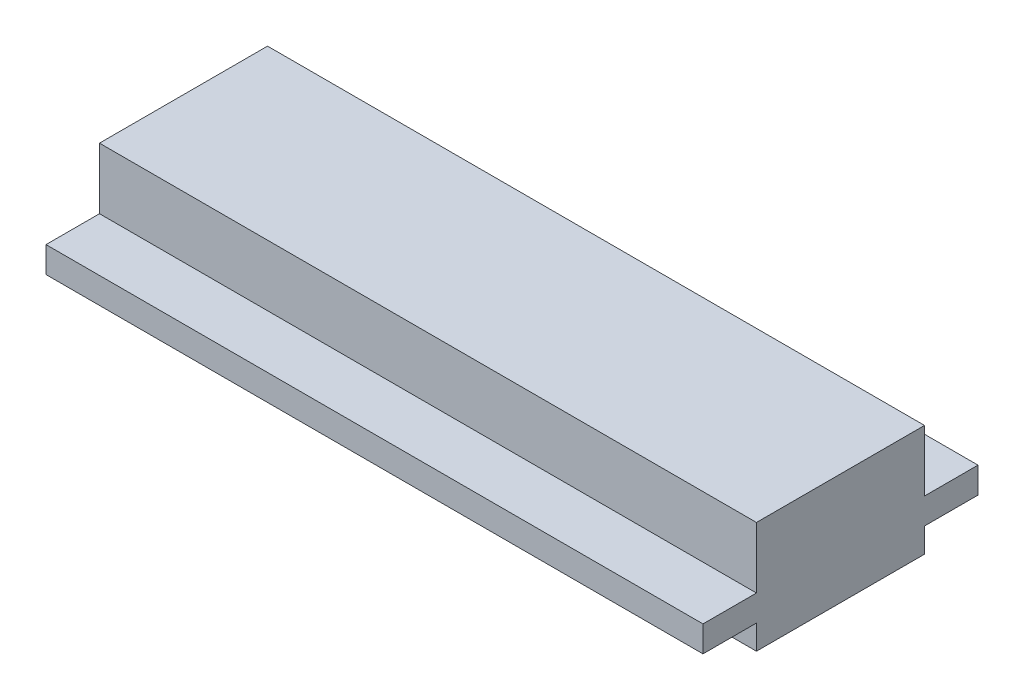
ISO-10303-21;
HEADER;
FILE_DESCRIPTION(('STEP AP214'),'2;1');
FILE_NAME('part.step','',(''),(''),'','','');
FILE_SCHEMA(('AUTOMOTIVE_DESIGN { 1 0 10303 214 1 1 1 1 }'));
ENDSEC;
DATA;
#1=APPLICATION_CONTEXT('core data for automotive mechanical design processes');
#2=APPLICATION_PROTOCOL_DEFINITION('international standard','automotive_design',2000,#1);
#3=PRODUCT_CONTEXT('',#1,'mechanical');
#4=PRODUCT('Part','Part','',(#3));
#5=PRODUCT_RELATED_PRODUCT_CATEGORY('part','',(#4));
#6=PRODUCT_DEFINITION_FORMATION('','',#4);
#7=PRODUCT_DEFINITION_CONTEXT('part definition',#1,'design');
#8=PRODUCT_DEFINITION('design','',#6,#7);
#9=PRODUCT_DEFINITION_SHAPE('','',#8);
#10=(LENGTH_UNIT() NAMED_UNIT(*) SI_UNIT(.MILLI.,.METRE.));
#11=(NAMED_UNIT(*) PLANE_ANGLE_UNIT() SI_UNIT($,.RADIAN.));
#12=(NAMED_UNIT(*) SI_UNIT($,.STERADIAN.) SOLID_ANGLE_UNIT());
#13=UNCERTAINTY_MEASURE_WITH_UNIT(LENGTH_MEASURE(1.E-05),#10,'distance_accuracy_value','');
#14=(GEOMETRIC_REPRESENTATION_CONTEXT(3) GLOBAL_UNCERTAINTY_ASSIGNED_CONTEXT((#13)) GLOBAL_UNIT_ASSIGNED_CONTEXT((#10,
#11,#12)) REPRESENTATION_CONTEXT('',''));
#15=CARTESIAN_POINT('',(0.,0.,0.));
#16=DIRECTION('',(0.,0.,1.));
#17=DIRECTION('',(1.,0.,0.));
#18=AXIS2_PLACEMENT_3D('',#15,#16,#17);
#19=CARTESIAN_POINT('',(0.,0.,0.));
#20=DIRECTION('',(0.,-1.,0.));
#21=DIRECTION('',(0.,0.,-1.));
#22=AXIS2_PLACEMENT_3D('',#19,#20,#21);
#23=PLANE('',#22);
#24=DIRECTION('',(-1.,0.,0.));
#25=VECTOR('',#24,1.);
#26=CARTESIAN_POINT('',(43.,0.,-3.5));
#27=LINE('',#26,#25);
#28=CARTESIAN_POINT('',(43.,0.,-3.5));
#29=VERTEX_POINT('',#28);
#30=CARTESIAN_POINT('',(0.,0.,-3.5));
#31=VERTEX_POINT('',#30);
#32=EDGE_CURVE('E49',#29,#31,#27,.T.);
#33=ORIENTED_EDGE('',*,*,#32,.F.);
#34=DIRECTION('',(0.,0.,-1.));
#35=VECTOR('',#34,1.);
#36=CARTESIAN_POINT('',(43.,0.,0.));
#37=LINE('',#36,#35);
#38=CARTESIAN_POINT('',(43.,0.,0.));
#39=VERTEX_POINT('',#38);
#40=EDGE_CURVE('E194',#39,#29,#37,.T.);
#41=ORIENTED_EDGE('',*,*,#40,.F.);
#42=DIRECTION('',(1.,0.,0.));
#43=VECTOR('',#42,1.);
#44=CARTESIAN_POINT('',(0.,0.,0.));
#45=LINE('',#44,#43);
#46=CARTESIAN_POINT('',(0.,0.,0.));
#47=VERTEX_POINT('',#46);
#48=EDGE_CURVE('E191',#47,#39,#45,.T.);
#49=ORIENTED_EDGE('',*,*,#48,.F.);
#50=DIRECTION('',(0.,0.,1.));
#51=VECTOR('',#50,1.);
#52=CARTESIAN_POINT('',(0.,0.,0.));
#53=LINE('',#52,#51);
#54=EDGE_CURVE('E54',#31,#47,#53,.T.);
#55=ORIENTED_EDGE('',*,*,#54,.F.);
#56=EDGE_LOOP('',(#33,#41,#49,#55));
#57=FACE_BOUND('',#56,.T.);
#58=ADVANCED_FACE('F34',(#57),#23,.T.);
#59=CARTESIAN_POINT('',(0.,1.7,0.));
#60=DIRECTION('',(0.,-1.,0.));
#61=DIRECTION('',(0.,0.,-1.));
#62=AXIS2_PLACEMENT_3D('',#59,#60,#61);
#63=PLANE('',#62);
#64=DIRECTION('',(-1.,0.,0.));
#65=VECTOR('',#64,1.);
#66=CARTESIAN_POINT('',(43.,1.7,-14.5));
#67=LINE('',#66,#65);
#68=CARTESIAN_POINT('',(43.,1.7,-14.5));
#69=VERTEX_POINT('',#68);
#70=CARTESIAN_POINT('',(0.,1.7,-14.5));
#71=VERTEX_POINT('',#70);
#72=EDGE_CURVE('E150',#69,#71,#67,.T.);
#73=ORIENTED_EDGE('',*,*,#72,.F.);
#74=DIRECTION('',(0.,0.,-1.));
#75=VECTOR('',#74,1.);
#76=CARTESIAN_POINT('',(43.,1.7,0.));
#77=LINE('',#76,#75);
#78=CARTESIAN_POINT('',(43.,1.7,-18.));
#79=VERTEX_POINT('',#78);
#80=EDGE_CURVE('E184',#69,#79,#77,.T.);
#81=ORIENTED_EDGE('',*,*,#80,.T.);
#82=DIRECTION('',(-1.,0.,0.));
#83=VECTOR('',#82,1.);
#84=CARTESIAN_POINT('',(0.,1.7,-18.));
#85=LINE('',#84,#83);
#86=CARTESIAN_POINT('',(0.,1.7,-18.));
#87=VERTEX_POINT('',#86);
#88=EDGE_CURVE('E187',#79,#87,#85,.T.);
#89=ORIENTED_EDGE('',*,*,#88,.T.);
#90=DIRECTION('',(0.,0.,1.));
#91=VECTOR('',#90,1.);
#92=CARTESIAN_POINT('',(0.,1.7,0.));
#93=LINE('',#92,#91);
#94=EDGE_CURVE('E179',#87,#71,#93,.T.);
#95=ORIENTED_EDGE('',*,*,#94,.T.);
#96=EDGE_LOOP('',(#73,#81,#89,#95));
#97=FACE_BOUND('',#96,.T.);
#98=ADVANCED_FACE('F233',(#97),#63,.F.);
#99=DIRECTION('',(1.,0.,0.));
#100=VECTOR('',#99,1.);
#101=CARTESIAN_POINT('',(43.,1.7,-3.5));
#102=LINE('',#101,#100);
#103=CARTESIAN_POINT('',(0.,1.7,-3.5));
#104=VERTEX_POINT('',#103);
#105=CARTESIAN_POINT('',(43.,1.7,-3.5));
#106=VERTEX_POINT('',#105);
#107=EDGE_CURVE('E147',#104,#106,#102,.T.);
#108=ORIENTED_EDGE('',*,*,#107,.F.);
#109=CARTESIAN_POINT('',(0.,1.7,0.));
#110=VERTEX_POINT('',#109);
#111=EDGE_CURVE('E182',#104,#110,#93,.T.);
#112=ORIENTED_EDGE('',*,*,#111,.T.);
#113=DIRECTION('',(1.,0.,0.));
#114=VECTOR('',#113,1.);
#115=CARTESIAN_POINT('',(0.,1.7,0.));
#116=LINE('',#115,#114);
#117=CARTESIAN_POINT('',(43.,1.7,0.));
#118=VERTEX_POINT('',#117);
#119=EDGE_CURVE('E181',#110,#118,#116,.T.);
#120=ORIENTED_EDGE('',*,*,#119,.T.);
#121=EDGE_CURVE('E185',#118,#106,#77,.T.);
#122=ORIENTED_EDGE('',*,*,#121,.T.);
#123=EDGE_LOOP('',(#108,#112,#120,#122));
#124=FACE_BOUND('',#123,.T.);
#125=ADVANCED_FACE('F239',(#124),#63,.F.);
#126=CARTESIAN_POINT('',(0.,1.7,0.));
#127=DIRECTION('',(1.,0.,0.));
#128=DIRECTION('',(0.,0.,-1.));
#129=AXIS2_PLACEMENT_3D('',#126,#127,#128);
#130=PLANE('',#129);
#131=CARTESIAN_POINT('',(0.,0.,-18.));
#132=VERTEX_POINT('',#131);
#133=CARTESIAN_POINT('',(0.,0.,-14.5));
#134=VERTEX_POINT('',#133);
#135=EDGE_CURVE('E146',#132,#134,#53,.T.);
#136=ORIENTED_EDGE('',*,*,#135,.T.);
#137=DIRECTION('',(0.,1.,0.));
#138=VECTOR('',#137,1.);
#139=CARTESIAN_POINT('',(0.,-1.6,-14.5));
#140=LINE('',#139,#138);
#141=CARTESIAN_POINT('',(0.,-1.6,-14.5));
#142=VERTEX_POINT('',#141);
#143=EDGE_CURVE('E127',#142,#134,#140,.T.);
#144=ORIENTED_EDGE('',*,*,#143,.F.);
#145=DIRECTION('',(0.,0.,-1.));
#146=VECTOR('',#145,1.);
#147=CARTESIAN_POINT('',(0.,-1.6,-14.5));
#148=LINE('',#147,#146);
#149=CARTESIAN_POINT('',(0.,-1.6,-3.5));
#150=VERTEX_POINT('',#149);
#151=EDGE_CURVE('E133',#150,#142,#148,.T.);
#152=ORIENTED_EDGE('',*,*,#151,.F.);
#153=DIRECTION('',(0.,1.,0.));
#154=VECTOR('',#153,1.);
#155=CARTESIAN_POINT('',(0.,-1.6,-3.5));
#156=LINE('',#155,#154);
#157=EDGE_CURVE('E214',#150,#31,#156,.T.);
#158=ORIENTED_EDGE('',*,*,#157,.T.);
#159=ORIENTED_EDGE('',*,*,#54,.T.);
#160=DIRECTION('',(0.,-1.,0.));
#161=VECTOR('',#160,1.);
#162=CARTESIAN_POINT('',(0.,1.7,0.));
#163=LINE('',#162,#161);
#164=EDGE_CURVE('E11',#110,#47,#163,.T.);
#165=ORIENTED_EDGE('',*,*,#164,.F.);
#166=ORIENTED_EDGE('',*,*,#111,.F.);
#167=DIRECTION('',(0.,-1.,0.));
#168=VECTOR('',#167,1.);
#169=CARTESIAN_POINT('',(0.,5.7,-3.5));
#170=LINE('',#169,#168);
#171=CARTESIAN_POINT('',(0.,5.7,-3.5));
#172=VERTEX_POINT('',#171);
#173=EDGE_CURVE('E176',#172,#104,#170,.T.);
#174=ORIENTED_EDGE('',*,*,#173,.F.);
#175=DIRECTION('',(0.,0.,1.));
#176=VECTOR('',#175,1.);
#177=CARTESIAN_POINT('',(0.,5.7,-3.5));
#178=LINE('',#177,#176);
#179=CARTESIAN_POINT('',(0.,5.7,-14.5));
#180=VERTEX_POINT('',#179);
#181=EDGE_CURVE('E156',#180,#172,#178,.T.);
#182=ORIENTED_EDGE('',*,*,#181,.F.);
#183=DIRECTION('',(0.,-1.,0.));
#184=VECTOR('',#183,1.);
#185=CARTESIAN_POINT('',(0.,5.7,-14.5));
#186=LINE('',#185,#184);
#187=EDGE_CURVE('E164',#180,#71,#186,.T.);
#188=ORIENTED_EDGE('',*,*,#187,.T.);
#189=ORIENTED_EDGE('',*,*,#94,.F.);
#190=DIRECTION('',(0.,-1.,0.));
#191=VECTOR('',#190,1.);
#192=CARTESIAN_POINT('',(0.,1.7,-18.));
#193=LINE('',#192,#191);
#194=EDGE_CURVE('E189',#87,#132,#193,.T.);
#195=ORIENTED_EDGE('',*,*,#194,.T.);
#196=EDGE_LOOP('',(#136,#144,#152,#158,#159,#165,#166,#174,#182,#188,#189,#195));
#197=FACE_BOUND('',#196,.T.);
#198=ADVANCED_FACE('F36',(#197),#130,.F.);
#199=CARTESIAN_POINT('',(0.,1.7,0.));
#200=DIRECTION('',(0.,0.,-1.));
#201=DIRECTION('',(-1.,0.,0.));
#202=AXIS2_PLACEMENT_3D('',#199,#200,#201);
#203=PLANE('',#202);
#204=ORIENTED_EDGE('',*,*,#48,.T.);
#205=DIRECTION('',(0.,-1.,0.));
#206=VECTOR('',#205,1.);
#207=CARTESIAN_POINT('',(43.,1.7,0.));
#208=LINE('',#207,#206);
#209=EDGE_CURVE('E42',#118,#39,#208,.T.);
#210=ORIENTED_EDGE('',*,*,#209,.F.);
#211=ORIENTED_EDGE('',*,*,#119,.F.);
#212=ORIENTED_EDGE('',*,*,#164,.T.);
#213=EDGE_LOOP('',(#204,#210,#211,#212));
#214=FACE_BOUND('',#213,.T.);
#215=ADVANCED_FACE('F211',(#214),#203,.F.);
#216=CARTESIAN_POINT('',(43.,1.7,0.));
#217=DIRECTION('',(-1.,0.,0.));
#218=DIRECTION('',(0.,0.,1.));
#219=AXIS2_PLACEMENT_3D('',#216,#217,#218);
#220=PLANE('',#219);
#221=ORIENTED_EDGE('',*,*,#40,.T.);
#222=DIRECTION('',(0.,1.,0.));
#223=VECTOR('',#222,1.);
#224=CARTESIAN_POINT('',(43.,-1.6,-3.5));
#225=LINE('',#224,#223);
#226=CARTESIAN_POINT('',(43.,-1.6,-3.5));
#227=VERTEX_POINT('',#226);
#228=EDGE_CURVE('E152',#227,#29,#225,.T.);
#229=ORIENTED_EDGE('',*,*,#228,.F.);
#230=DIRECTION('',(0.,0.,1.));
#231=VECTOR('',#230,1.);
#232=CARTESIAN_POINT('',(43.,-1.6,-14.5));
#233=LINE('',#232,#231);
#234=CARTESIAN_POINT('',(43.,-1.6,-14.5));
#235=VERTEX_POINT('',#234);
#236=EDGE_CURVE('E132',#235,#227,#233,.T.);
#237=ORIENTED_EDGE('',*,*,#236,.F.);
#238=DIRECTION('',(0.,1.,0.));
#239=VECTOR('',#238,1.);
#240=CARTESIAN_POINT('',(43.,-1.6,-14.5));
#241=LINE('',#240,#239);
#242=CARTESIAN_POINT('',(43.,0.,-14.5));
#243=VERTEX_POINT('',#242);
#244=EDGE_CURVE('E129',#235,#243,#241,.T.);
#245=ORIENTED_EDGE('',*,*,#244,.T.);
#246=CARTESIAN_POINT('',(43.,0.,-18.));
#247=VERTEX_POINT('',#246);
#248=EDGE_CURVE('E193',#243,#247,#37,.T.);
#249=ORIENTED_EDGE('',*,*,#248,.T.);
#250=DIRECTION('',(0.,-1.,0.));
#251=VECTOR('',#250,1.);
#252=CARTESIAN_POINT('',(43.,1.7,-18.));
#253=LINE('',#252,#251);
#254=EDGE_CURVE('E199',#79,#247,#253,.T.);
#255=ORIENTED_EDGE('',*,*,#254,.F.);
#256=ORIENTED_EDGE('',*,*,#80,.F.);
#257=DIRECTION('',(0.,-1.,0.));
#258=VECTOR('',#257,1.);
#259=CARTESIAN_POINT('',(43.,5.7,-14.5));
#260=LINE('',#259,#258);
#261=CARTESIAN_POINT('',(43.,5.7,-14.5));
#262=VERTEX_POINT('',#261);
#263=EDGE_CURVE('E170',#262,#69,#260,.T.);
#264=ORIENTED_EDGE('',*,*,#263,.F.);
#265=DIRECTION('',(0.,0.,-1.));
#266=VECTOR('',#265,1.);
#267=CARTESIAN_POINT('',(43.,5.7,-3.5));
#268=LINE('',#267,#266);
#269=CARTESIAN_POINT('',(43.,5.7,-3.5));
#270=VERTEX_POINT('',#269);
#271=EDGE_CURVE('E161',#270,#262,#268,.T.);
#272=ORIENTED_EDGE('',*,*,#271,.F.);
#273=DIRECTION('',(0.,-1.,0.));
#274=VECTOR('',#273,1.);
#275=CARTESIAN_POINT('',(43.,5.7,-3.5));
#276=LINE('',#275,#274);
#277=EDGE_CURVE('E173',#270,#106,#276,.T.);
#278=ORIENTED_EDGE('',*,*,#277,.T.);
#279=ORIENTED_EDGE('',*,*,#121,.F.);
#280=ORIENTED_EDGE('',*,*,#209,.T.);
#281=EDGE_LOOP('',(#221,#229,#237,#245,#249,#255,#256,#264,#272,#278,#279,#280));
#282=FACE_BOUND('',#281,.T.);
#283=ADVANCED_FACE('F205',(#282),#220,.F.);
#284=CARTESIAN_POINT('',(0.,1.7,-18.));
#285=DIRECTION('',(0.,0.,1.));
#286=DIRECTION('',(1.,0.,0.));
#287=AXIS2_PLACEMENT_3D('',#284,#285,#286);
#288=PLANE('',#287);
#289=DIRECTION('',(-1.,0.,0.));
#290=VECTOR('',#289,1.);
#291=CARTESIAN_POINT('',(0.,0.,-18.));
#292=LINE('',#291,#290);
#293=EDGE_CURVE('E196',#247,#132,#292,.T.);
#294=ORIENTED_EDGE('',*,*,#293,.T.);
#295=ORIENTED_EDGE('',*,*,#194,.F.);
#296=ORIENTED_EDGE('',*,*,#88,.F.);
#297=ORIENTED_EDGE('',*,*,#254,.T.);
#298=EDGE_LOOP('',(#294,#295,#296,#297));
#299=FACE_BOUND('',#298,.T.);
#300=ADVANCED_FACE('F245',(#299),#288,.F.);
#301=DIRECTION('',(1.,0.,0.));
#302=VECTOR('',#301,1.);
#303=CARTESIAN_POINT('',(43.,0.,-14.5));
#304=LINE('',#303,#302);
#305=EDGE_CURVE('E220',#134,#243,#304,.T.);
#306=ORIENTED_EDGE('',*,*,#305,.F.);
#307=ORIENTED_EDGE('',*,*,#135,.F.);
#308=ORIENTED_EDGE('',*,*,#293,.F.);
#309=ORIENTED_EDGE('',*,*,#248,.F.);
#310=EDGE_LOOP('',(#306,#307,#308,#309));
#311=FACE_BOUND('',#310,.T.);
#312=ADVANCED_FACE('F235',(#311),#23,.T.);
#313=CARTESIAN_POINT('',(43.,5.7,-3.5));
#314=DIRECTION('',(0.,0.,-1.));
#315=DIRECTION('',(-1.,0.,0.));
#316=AXIS2_PLACEMENT_3D('',#313,#314,#315);
#317=PLANE('',#316);
#318=ORIENTED_EDGE('',*,*,#107,.T.);
#319=ORIENTED_EDGE('',*,*,#277,.F.);
#320=DIRECTION('',(1.,0.,0.));
#321=VECTOR('',#320,1.);
#322=CARTESIAN_POINT('',(43.,5.7,-3.5));
#323=LINE('',#322,#321);
#324=EDGE_CURVE('E159',#172,#270,#323,.T.);
#325=ORIENTED_EDGE('',*,*,#324,.F.);
#326=ORIENTED_EDGE('',*,*,#173,.T.);
#327=EDGE_LOOP('',(#318,#319,#325,#326));
#328=FACE_BOUND('',#327,.T.);
#329=ADVANCED_FACE('F244',(#328),#317,.F.);
#330=CARTESIAN_POINT('',(43.,5.7,-14.5));
#331=DIRECTION('',(0.,0.,1.));
#332=DIRECTION('',(1.,0.,0.));
#333=AXIS2_PLACEMENT_3D('',#330,#331,#332);
#334=PLANE('',#333);
#335=ORIENTED_EDGE('',*,*,#72,.T.);
#336=ORIENTED_EDGE('',*,*,#187,.F.);
#337=DIRECTION('',(-1.,0.,0.));
#338=VECTOR('',#337,1.);
#339=CARTESIAN_POINT('',(43.,5.7,-14.5));
#340=LINE('',#339,#338);
#341=EDGE_CURVE('E163',#262,#180,#340,.T.);
#342=ORIENTED_EDGE('',*,*,#341,.F.);
#343=ORIENTED_EDGE('',*,*,#263,.T.);
#344=EDGE_LOOP('',(#335,#336,#342,#343));
#345=FACE_BOUND('',#344,.T.);
#346=ADVANCED_FACE('F251',(#345),#334,.F.);
#347=CARTESIAN_POINT('',(0.,5.7,0.));
#348=DIRECTION('',(0.,1.,0.));
#349=DIRECTION('',(0.,0.,1.));
#350=AXIS2_PLACEMENT_3D('',#347,#348,#349);
#351=PLANE('',#350);
#352=ORIENTED_EDGE('',*,*,#181,.T.);
#353=ORIENTED_EDGE('',*,*,#324,.T.);
#354=ORIENTED_EDGE('',*,*,#271,.T.);
#355=ORIENTED_EDGE('',*,*,#341,.T.);
#356=EDGE_LOOP('',(#352,#353,#354,#355));
#357=FACE_BOUND('',#356,.T.);
#358=ADVANCED_FACE('F230',(#357),#351,.T.);
#359=CARTESIAN_POINT('',(43.,-1.6,-14.5));
#360=DIRECTION('',(0.,0.,1.));
#361=DIRECTION('',(1.,0.,0.));
#362=AXIS2_PLACEMENT_3D('',#359,#360,#361);
#363=PLANE('',#362);
#364=ORIENTED_EDGE('',*,*,#305,.T.);
#365=ORIENTED_EDGE('',*,*,#244,.F.);
#366=DIRECTION('',(1.,0.,0.));
#367=VECTOR('',#366,1.);
#368=CARTESIAN_POINT('',(43.,-1.6,-14.5));
#369=LINE('',#368,#367);
#370=EDGE_CURVE('E122',#142,#235,#369,.T.);
#371=ORIENTED_EDGE('',*,*,#370,.F.);
#372=ORIENTED_EDGE('',*,*,#143,.T.);
#373=EDGE_LOOP('',(#364,#365,#371,#372));
#374=FACE_BOUND('',#373,.T.);
#375=ADVANCED_FACE('F125',(#374),#363,.F.);
#376=CARTESIAN_POINT('',(43.,-1.6,-3.5));
#377=DIRECTION('',(0.,0.,-1.));
#378=DIRECTION('',(-1.,0.,0.));
#379=AXIS2_PLACEMENT_3D('',#376,#377,#378);
#380=PLANE('',#379);
#381=ORIENTED_EDGE('',*,*,#32,.T.);
#382=ORIENTED_EDGE('',*,*,#157,.F.);
#383=DIRECTION('',(-1.,0.,0.));
#384=VECTOR('',#383,1.);
#385=CARTESIAN_POINT('',(43.,-1.6,-3.5));
#386=LINE('',#385,#384);
#387=EDGE_CURVE('E138',#227,#150,#386,.T.);
#388=ORIENTED_EDGE('',*,*,#387,.F.);
#389=ORIENTED_EDGE('',*,*,#228,.T.);
#390=EDGE_LOOP('',(#381,#382,#388,#389));
#391=FACE_BOUND('',#390,.T.);
#392=ADVANCED_FACE('F222',(#391),#380,.F.);
#393=CARTESIAN_POINT('',(0.,-1.6,0.));
#394=DIRECTION('',(0.,-1.,0.));
#395=DIRECTION('',(0.,0.,-1.));
#396=AXIS2_PLACEMENT_3D('',#393,#394,#395);
#397=PLANE('',#396);
#398=ORIENTED_EDGE('',*,*,#151,.T.);
#399=ORIENTED_EDGE('',*,*,#370,.T.);
#400=ORIENTED_EDGE('',*,*,#236,.T.);
#401=ORIENTED_EDGE('',*,*,#387,.T.);
#402=EDGE_LOOP('',(#398,#399,#400,#401));
#403=FACE_BOUND('',#402,.T.);
#404=ADVANCED_FACE('F136',(#403),#397,.T.);
#405=CLOSED_SHELL('',(#58,#98,#125,#198,#215,#283,#300,#312,#329,#346,#358,#375,#392,#404));
#406=MANIFOLD_SOLID_BREP('B2',#405);
#407=ADVANCED_BREP_SHAPE_REPRESENTATION('',(#18,#406),#14);
#408=SHAPE_DEFINITION_REPRESENTATION(#9,#407);
ENDSEC;
END-ISO-10303-21;
